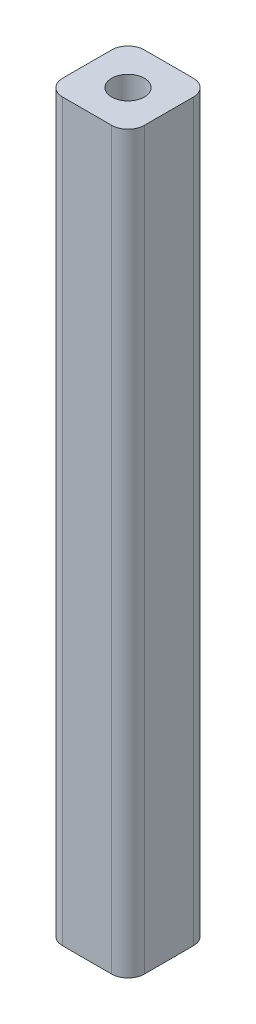
ISO-10303-21;
HEADER;
FILE_DESCRIPTION(('STEP AP214'),'2;1');
FILE_NAME('part.step','',(''),(''),'','','');
FILE_SCHEMA(('AUTOMOTIVE_DESIGN { 1 0 10303 214 1 1 1 1 }'));
ENDSEC;
DATA;
#1=APPLICATION_CONTEXT('core data for automotive mechanical design processes');
#2=APPLICATION_PROTOCOL_DEFINITION('international standard','automotive_design',2000,#1);
#3=PRODUCT_CONTEXT('',#1,'mechanical');
#4=PRODUCT('Part','Part','',(#3));
#5=PRODUCT_RELATED_PRODUCT_CATEGORY('part','',(#4));
#6=PRODUCT_DEFINITION_FORMATION('','',#4);
#7=PRODUCT_DEFINITION_CONTEXT('part definition',#1,'design');
#8=PRODUCT_DEFINITION('design','',#6,#7);
#9=PRODUCT_DEFINITION_SHAPE('','',#8);
#10=(LENGTH_UNIT() NAMED_UNIT(*) SI_UNIT(.MILLI.,.METRE.));
#11=(NAMED_UNIT(*) PLANE_ANGLE_UNIT() SI_UNIT($,.RADIAN.));
#12=(NAMED_UNIT(*) SI_UNIT($,.STERADIAN.) SOLID_ANGLE_UNIT());
#13=UNCERTAINTY_MEASURE_WITH_UNIT(LENGTH_MEASURE(1.E-05),#10,'distance_accuracy_value','');
#14=(GEOMETRIC_REPRESENTATION_CONTEXT(3) GLOBAL_UNCERTAINTY_ASSIGNED_CONTEXT((#13)) GLOBAL_UNIT_ASSIGNED_CONTEXT((#10,
#11,#12)) REPRESENTATION_CONTEXT('',''));
#15=CARTESIAN_POINT('',(0.,0.,0.));
#16=DIRECTION('',(0.,0.,1.));
#17=DIRECTION('',(1.,0.,0.));
#18=AXIS2_PLACEMENT_3D('',#15,#16,#17);
#19=CARTESIAN_POINT('',(-5.,90.,5.));
#20=DIRECTION('',(1.,0.,0.));
#21=DIRECTION('',(0.,0.,-1.));
#22=AXIS2_PLACEMENT_3D('',#19,#20,#21);
#23=PLANE('',#22);
#24=DIRECTION('',(0.,0.,1.));
#25=VECTOR('',#24,1.);
#26=CARTESIAN_POINT('',(-5.,0.,5.));
#27=LINE('',#26,#25);
#28=CARTESIAN_POINT('',(-5.,0.,-3.));
#29=VERTEX_POINT('',#28);
#30=CARTESIAN_POINT('',(-5.,0.,3.));
#31=VERTEX_POINT('',#30);
#32=EDGE_CURVE('E127',#29,#31,#27,.T.);
#33=ORIENTED_EDGE('',*,*,#32,.T.);
#34=DIRECTION('',(0.,-1.,0.));
#35=VECTOR('',#34,1.);
#36=CARTESIAN_POINT('',(-5.,90.,3.));
#37=LINE('',#36,#35);
#38=CARTESIAN_POINT('',(-5.,90.,3.));
#39=VERTEX_POINT('',#38);
#40=EDGE_CURVE('E105',#31,#39,#37,.F.);
#41=ORIENTED_EDGE('',*,*,#40,.T.);
#42=DIRECTION('',(0.,0.,1.));
#43=VECTOR('',#42,1.);
#44=CARTESIAN_POINT('',(-5.,90.,5.));
#45=LINE('',#44,#43);
#46=CARTESIAN_POINT('',(-5.,90.,-3.));
#47=VERTEX_POINT('',#46);
#48=EDGE_CURVE('E137',#47,#39,#45,.T.);
#49=ORIENTED_EDGE('',*,*,#48,.F.);
#50=DIRECTION('',(0.,-1.,0.));
#51=VECTOR('',#50,1.);
#52=CARTESIAN_POINT('',(-5.,90.,-3.));
#53=LINE('',#52,#51);
#54=EDGE_CURVE('E110',#47,#29,#53,.T.);
#55=ORIENTED_EDGE('',*,*,#54,.T.);
#56=EDGE_LOOP('',(#33,#41,#49,#55));
#57=FACE_BOUND('',#56,.T.);
#58=ADVANCED_FACE('F34',(#57),#23,.F.);
#59=CARTESIAN_POINT('',(5.,90.,5.));
#60=DIRECTION('',(0.,0.,-1.));
#61=DIRECTION('',(-1.,0.,0.));
#62=AXIS2_PLACEMENT_3D('',#59,#60,#61);
#63=PLANE('',#62);
#64=DIRECTION('',(1.,0.,0.));
#65=VECTOR('',#64,1.);
#66=CARTESIAN_POINT('',(5.,90.,5.));
#67=LINE('',#66,#65);
#68=CARTESIAN_POINT('',(-3.,90.,5.));
#69=VERTEX_POINT('',#68);
#70=CARTESIAN_POINT('',(3.,90.,5.));
#71=VERTEX_POINT('',#70);
#72=EDGE_CURVE('E120',#69,#71,#67,.T.);
#73=ORIENTED_EDGE('',*,*,#72,.F.);
#74=DIRECTION('',(0.,-1.,0.));
#75=VECTOR('',#74,1.);
#76=CARTESIAN_POINT('',(-3.,90.,5.));
#77=LINE('',#76,#75);
#78=CARTESIAN_POINT('',(-3.,0.,5.));
#79=VERTEX_POINT('',#78);
#80=EDGE_CURVE('E104',#69,#79,#77,.T.);
#81=ORIENTED_EDGE('',*,*,#80,.T.);
#82=DIRECTION('',(1.,0.,0.));
#83=VECTOR('',#82,1.);
#84=CARTESIAN_POINT('',(5.,0.,5.));
#85=LINE('',#84,#83);
#86=CARTESIAN_POINT('',(3.,0.,5.));
#87=VERTEX_POINT('',#86);
#88=EDGE_CURVE('E117',#79,#87,#85,.T.);
#89=ORIENTED_EDGE('',*,*,#88,.T.);
#90=DIRECTION('',(0.,-1.,0.));
#91=VECTOR('',#90,1.);
#92=CARTESIAN_POINT('',(3.,90.,5.));
#93=LINE('',#92,#91);
#94=EDGE_CURVE('E122',#87,#71,#93,.F.);
#95=ORIENTED_EDGE('',*,*,#94,.T.);
#96=EDGE_LOOP('',(#73,#81,#89,#95));
#97=FACE_BOUND('',#96,.T.);
#98=ADVANCED_FACE('F116',(#97),#63,.F.);
#99=CARTESIAN_POINT('',(5.,90.,5.));
#100=DIRECTION('',(-1.,0.,0.));
#101=DIRECTION('',(0.,0.,1.));
#102=AXIS2_PLACEMENT_3D('',#99,#100,#101);
#103=PLANE('',#102);
#104=DIRECTION('',(0.,0.,-1.));
#105=VECTOR('',#104,1.);
#106=CARTESIAN_POINT('',(5.,90.,5.));
#107=LINE('',#106,#105);
#108=CARTESIAN_POINT('',(5.,90.,3.));
#109=VERTEX_POINT('',#108);
#110=CARTESIAN_POINT('',(5.,90.,-3.));
#111=VERTEX_POINT('',#110);
#112=EDGE_CURVE('E163',#109,#111,#107,.T.);
#113=ORIENTED_EDGE('',*,*,#112,.F.);
#114=DIRECTION('',(0.,-1.,0.));
#115=VECTOR('',#114,1.);
#116=CARTESIAN_POINT('',(5.,90.,3.));
#117=LINE('',#116,#115);
#118=CARTESIAN_POINT('',(5.,0.,3.));
#119=VERTEX_POINT('',#118);
#120=EDGE_CURVE('E156',#109,#119,#117,.T.);
#121=ORIENTED_EDGE('',*,*,#120,.T.);
#122=DIRECTION('',(0.,0.,-1.));
#123=VECTOR('',#122,1.);
#124=CARTESIAN_POINT('',(5.,0.,5.));
#125=LINE('',#124,#123);
#126=CARTESIAN_POINT('',(5.,0.,-3.));
#127=VERTEX_POINT('',#126);
#128=EDGE_CURVE('E126',#119,#127,#125,.T.);
#129=ORIENTED_EDGE('',*,*,#128,.T.);
#130=DIRECTION('',(0.,-1.,0.));
#131=VECTOR('',#130,1.);
#132=CARTESIAN_POINT('',(5.,90.,-3.));
#133=LINE('',#132,#131);
#134=EDGE_CURVE('E154',#127,#111,#133,.F.);
#135=ORIENTED_EDGE('',*,*,#134,.T.);
#136=EDGE_LOOP('',(#113,#121,#129,#135));
#137=FACE_BOUND('',#136,.T.);
#138=ADVANCED_FACE('F161',(#137),#103,.F.);
#139=CARTESIAN_POINT('',(5.,90.,-5.));
#140=DIRECTION('',(0.,0.,1.));
#141=DIRECTION('',(1.,0.,0.));
#142=AXIS2_PLACEMENT_3D('',#139,#140,#141);
#143=PLANE('',#142);
#144=DIRECTION('',(-1.,0.,0.));
#145=VECTOR('',#144,1.);
#146=CARTESIAN_POINT('',(5.,90.,-5.));
#147=LINE('',#146,#145);
#148=CARTESIAN_POINT('',(3.,90.,-5.));
#149=VERTEX_POINT('',#148);
#150=CARTESIAN_POINT('',(-3.,90.,-5.));
#151=VERTEX_POINT('',#150);
#152=EDGE_CURVE('E138',#149,#151,#147,.T.);
#153=ORIENTED_EDGE('',*,*,#152,.F.);
#154=DIRECTION('',(0.,-1.,0.));
#155=VECTOR('',#154,1.);
#156=CARTESIAN_POINT('',(3.,90.,-5.));
#157=LINE('',#156,#155);
#158=CARTESIAN_POINT('',(3.,0.,-5.));
#159=VERTEX_POINT('',#158);
#160=EDGE_CURVE('E11',#149,#159,#157,.T.);
#161=ORIENTED_EDGE('',*,*,#160,.T.);
#162=DIRECTION('',(-1.,0.,0.));
#163=VECTOR('',#162,1.);
#164=CARTESIAN_POINT('',(5.,0.,-5.));
#165=LINE('',#164,#163);
#166=CARTESIAN_POINT('',(-3.,0.,-5.));
#167=VERTEX_POINT('',#166);
#168=EDGE_CURVE('E130',#159,#167,#165,.T.);
#169=ORIENTED_EDGE('',*,*,#168,.T.);
#170=DIRECTION('',(0.,-1.,0.));
#171=VECTOR('',#170,1.);
#172=CARTESIAN_POINT('',(-3.,90.,-5.));
#173=LINE('',#172,#171);
#174=EDGE_CURVE('E42',#167,#151,#173,.F.);
#175=ORIENTED_EDGE('',*,*,#174,.T.);
#176=EDGE_LOOP('',(#153,#161,#169,#175));
#177=FACE_BOUND('',#176,.T.);
#178=ADVANCED_FACE('F170',(#177),#143,.F.);
#179=CARTESIAN_POINT('',(0.,90.,0.));
#180=DIRECTION('',(0.,1.,0.));
#181=DIRECTION('',(0.,0.,1.));
#182=AXIS2_PLACEMENT_3D('',#179,#180,#181);
#183=PLANE('',#182);
#184=CARTESIAN_POINT('',(0.,90.,0.));
#185=DIRECTION('',(0.,1.,0.));
#186=DIRECTION('',(0.,0.,1.));
#187=AXIS2_PLACEMENT_3D('',#184,#185,#186);
#188=CIRCLE('',#187,2.);
#189=CARTESIAN_POINT('',(0.,90.,2.));
#190=VERTEX_POINT('',#189);
#191=EDGE_CURVE('E177',#190,#190,#188,.T.);
#192=ORIENTED_EDGE('',*,*,#191,.F.);
#193=EDGE_LOOP('',(#192));
#194=FACE_BOUND('',#193,.T.);
#195=ORIENTED_EDGE('',*,*,#48,.T.);
#196=CARTESIAN_POINT('',(-3.,90.,3.));
#197=DIRECTION('',(0.,1.,0.));
#198=DIRECTION('',(0.,0.,1.));
#199=AXIS2_PLACEMENT_3D('',#196,#197,#198);
#200=CIRCLE('',#199,2.);
#201=EDGE_CURVE('E152',#39,#69,#200,.T.);
#202=ORIENTED_EDGE('',*,*,#201,.T.);
#203=ORIENTED_EDGE('',*,*,#72,.T.);
#204=CARTESIAN_POINT('',(3.,90.,3.));
#205=DIRECTION('',(0.,1.,0.));
#206=DIRECTION('',(0.,0.,1.));
#207=AXIS2_PLACEMENT_3D('',#204,#205,#206);
#208=CIRCLE('',#207,2.);
#209=EDGE_CURVE('E150',#71,#109,#208,.T.);
#210=ORIENTED_EDGE('',*,*,#209,.T.);
#211=ORIENTED_EDGE('',*,*,#112,.T.);
#212=CARTESIAN_POINT('',(3.,90.,-3.));
#213=DIRECTION('',(0.,1.,0.));
#214=DIRECTION('',(0.,0.,1.));
#215=AXIS2_PLACEMENT_3D('',#212,#213,#214);
#216=CIRCLE('',#215,2.);
#217=EDGE_CURVE('E55',#111,#149,#216,.T.);
#218=ORIENTED_EDGE('',*,*,#217,.T.);
#219=ORIENTED_EDGE('',*,*,#152,.T.);
#220=CARTESIAN_POINT('',(-3.,90.,-3.));
#221=DIRECTION('',(0.,1.,0.));
#222=DIRECTION('',(0.,0.,1.));
#223=AXIS2_PLACEMENT_3D('',#220,#221,#222);
#224=CIRCLE('',#223,2.);
#225=EDGE_CURVE('E147',#151,#47,#224,.T.);
#226=ORIENTED_EDGE('',*,*,#225,.T.);
#227=EDGE_LOOP('',(#195,#202,#203,#210,#211,#218,#219,#226));
#228=FACE_BOUND('',#227,.T.);
#229=ADVANCED_FACE('F200',(#194,#228),#183,.T.);
#230=CARTESIAN_POINT('',(0.,0.,0.));
#231=DIRECTION('',(0.,1.,0.));
#232=DIRECTION('',(0.,0.,1.));
#233=AXIS2_PLACEMENT_3D('',#230,#231,#232);
#234=PLANE('',#233);
#235=CARTESIAN_POINT('',(0.,0.,0.));
#236=DIRECTION('',(0.,-1.,0.));
#237=DIRECTION('',(0.,0.,-1.));
#238=AXIS2_PLACEMENT_3D('',#235,#236,#237);
#239=CIRCLE('',#238,2.);
#240=CARTESIAN_POINT('',(0.,0.,-2.));
#241=VERTEX_POINT('',#240);
#242=EDGE_CURVE('E183',#241,#241,#239,.T.);
#243=ORIENTED_EDGE('',*,*,#242,.F.);
#244=EDGE_LOOP('',(#243));
#245=FACE_BOUND('',#244,.T.);
#246=ORIENTED_EDGE('',*,*,#88,.F.);
#247=CARTESIAN_POINT('',(-3.,0.,3.));
#248=DIRECTION('',(0.,1.,0.));
#249=DIRECTION('',(0.,0.,1.));
#250=AXIS2_PLACEMENT_3D('',#247,#248,#249);
#251=CIRCLE('',#250,2.);
#252=EDGE_CURVE('E100',#79,#31,#251,.F.);
#253=ORIENTED_EDGE('',*,*,#252,.T.);
#254=ORIENTED_EDGE('',*,*,#32,.F.);
#255=CARTESIAN_POINT('',(-3.,0.,-3.));
#256=DIRECTION('',(0.,1.,0.));
#257=DIRECTION('',(0.,0.,1.));
#258=AXIS2_PLACEMENT_3D('',#255,#256,#257);
#259=CIRCLE('',#258,2.);
#260=EDGE_CURVE('E121',#29,#167,#259,.F.);
#261=ORIENTED_EDGE('',*,*,#260,.T.);
#262=ORIENTED_EDGE('',*,*,#168,.F.);
#263=CARTESIAN_POINT('',(3.,0.,-3.));
#264=DIRECTION('',(0.,1.,0.));
#265=DIRECTION('',(0.,0.,1.));
#266=AXIS2_PLACEMENT_3D('',#263,#264,#265);
#267=CIRCLE('',#266,2.);
#268=EDGE_CURVE('E141',#159,#127,#267,.F.);
#269=ORIENTED_EDGE('',*,*,#268,.T.);
#270=ORIENTED_EDGE('',*,*,#128,.F.);
#271=CARTESIAN_POINT('',(3.,0.,3.));
#272=DIRECTION('',(0.,1.,0.));
#273=DIRECTION('',(0.,0.,1.));
#274=AXIS2_PLACEMENT_3D('',#271,#272,#273);
#275=CIRCLE('',#274,2.);
#276=EDGE_CURVE('E111',#119,#87,#275,.F.);
#277=ORIENTED_EDGE('',*,*,#276,.T.);
#278=EDGE_LOOP('',(#246,#253,#254,#261,#262,#269,#270,#277));
#279=FACE_BOUND('',#278,.T.);
#280=ADVANCED_FACE('F124',(#245,#279),#234,.F.);
#281=CARTESIAN_POINT('',(0.,80.,0.));
#282=DIRECTION('',(0.,1.,0.));
#283=DIRECTION('',(0.,0.,1.));
#284=AXIS2_PLACEMENT_3D('',#281,#282,#283);
#285=CYLINDRICAL_SURFACE('',#284,2.);
#286=CARTESIAN_POINT('',(0.,80.,0.));
#287=DIRECTION('',(0.,1.,0.));
#288=DIRECTION('',(0.,0.,1.));
#289=AXIS2_PLACEMENT_3D('',#286,#287,#288);
#290=CIRCLE('',#289,2.);
#291=CARTESIAN_POINT('',(0.,80.,2.));
#292=VERTEX_POINT('',#291);
#293=EDGE_CURVE('E132',#292,#292,#290,.T.);
#294=ORIENTED_EDGE('',*,*,#293,.F.);
#295=EDGE_LOOP('',(#294));
#296=FACE_BOUND('',#295,.T.);
#297=ORIENTED_EDGE('',*,*,#191,.T.);
#298=EDGE_LOOP('',(#297));
#299=FACE_BOUND('',#298,.T.);
#300=ADVANCED_FACE('F199',(#296,#299),#285,.F.);
#301=CARTESIAN_POINT('',(0.,80.,0.));
#302=DIRECTION('',(0.,1.,0.));
#303=DIRECTION('',(0.,0.,1.));
#304=AXIS2_PLACEMENT_3D('',#301,#302,#303);
#305=PLANE('',#304);
#306=ORIENTED_EDGE('',*,*,#293,.T.);
#307=EDGE_LOOP('',(#306));
#308=FACE_BOUND('',#307,.T.);
#309=ADVANCED_FACE('F194',(#308),#305,.T.);
#310=CARTESIAN_POINT('',(0.,10.,0.));
#311=DIRECTION('',(0.,-1.,0.));
#312=DIRECTION('',(0.,0.,-1.));
#313=AXIS2_PLACEMENT_3D('',#310,#311,#312);
#314=CYLINDRICAL_SURFACE('',#313,2.);
#315=CARTESIAN_POINT('',(0.,10.,0.));
#316=DIRECTION('',(0.,-1.,0.));
#317=DIRECTION('',(0.,0.,-1.));
#318=AXIS2_PLACEMENT_3D('',#315,#316,#317);
#319=CIRCLE('',#318,2.);
#320=CARTESIAN_POINT('',(0.,10.,-2.));
#321=VERTEX_POINT('',#320);
#322=EDGE_CURVE('E180',#321,#321,#319,.T.);
#323=ORIENTED_EDGE('',*,*,#322,.F.);
#324=EDGE_LOOP('',(#323));
#325=FACE_BOUND('',#324,.T.);
#326=ORIENTED_EDGE('',*,*,#242,.T.);
#327=EDGE_LOOP('',(#326));
#328=FACE_BOUND('',#327,.T.);
#329=ADVANCED_FACE('F191',(#325,#328),#314,.F.);
#330=CARTESIAN_POINT('',(0.,10.,0.));
#331=DIRECTION('',(0.,-1.,0.));
#332=DIRECTION('',(0.,0.,-1.));
#333=AXIS2_PLACEMENT_3D('',#330,#331,#332);
#334=PLANE('',#333);
#335=ORIENTED_EDGE('',*,*,#322,.T.);
#336=EDGE_LOOP('',(#335));
#337=FACE_BOUND('',#336,.T.);
#338=ADVANCED_FACE('F189',(#337),#334,.T.);
#339=CARTESIAN_POINT('',(-3.,90.,3.));
#340=DIRECTION('',(0.,-1.,0.));
#341=DIRECTION('',(0.,0.,-1.));
#342=AXIS2_PLACEMENT_3D('',#339,#340,#341);
#343=CYLINDRICAL_SURFACE('',#342,2.);
#344=ORIENTED_EDGE('',*,*,#201,.F.);
#345=ORIENTED_EDGE('',*,*,#40,.F.);
#346=ORIENTED_EDGE('',*,*,#252,.F.);
#347=ORIENTED_EDGE('',*,*,#80,.F.);
#348=EDGE_LOOP('',(#344,#345,#346,#347));
#349=FACE_BOUND('',#348,.T.);
#350=ADVANCED_FACE('F103',(#349),#343,.T.);
#351=CARTESIAN_POINT('',(3.,90.,3.));
#352=DIRECTION('',(0.,-1.,0.));
#353=DIRECTION('',(0.,0.,-1.));
#354=AXIS2_PLACEMENT_3D('',#351,#352,#353);
#355=CYLINDRICAL_SURFACE('',#354,2.);
#356=ORIENTED_EDGE('',*,*,#209,.F.);
#357=ORIENTED_EDGE('',*,*,#94,.F.);
#358=ORIENTED_EDGE('',*,*,#276,.F.);
#359=ORIENTED_EDGE('',*,*,#120,.F.);
#360=EDGE_LOOP('',(#356,#357,#358,#359));
#361=FACE_BOUND('',#360,.T.);
#362=ADVANCED_FACE('F222',(#361),#355,.T.);
#363=CARTESIAN_POINT('',(3.,90.,-3.));
#364=DIRECTION('',(0.,-1.,0.));
#365=DIRECTION('',(0.,0.,-1.));
#366=AXIS2_PLACEMENT_3D('',#363,#364,#365);
#367=CYLINDRICAL_SURFACE('',#366,2.);
#368=ORIENTED_EDGE('',*,*,#217,.F.);
#369=ORIENTED_EDGE('',*,*,#134,.F.);
#370=ORIENTED_EDGE('',*,*,#268,.F.);
#371=ORIENTED_EDGE('',*,*,#160,.F.);
#372=EDGE_LOOP('',(#368,#369,#370,#371));
#373=FACE_BOUND('',#372,.T.);
#374=ADVANCED_FACE('F169',(#373),#367,.T.);
#375=CARTESIAN_POINT('',(-3.,90.,-3.));
#376=DIRECTION('',(0.,-1.,0.));
#377=DIRECTION('',(0.,0.,-1.));
#378=AXIS2_PLACEMENT_3D('',#375,#376,#377);
#379=CYLINDRICAL_SURFACE('',#378,2.);
#380=ORIENTED_EDGE('',*,*,#225,.F.);
#381=ORIENTED_EDGE('',*,*,#174,.F.);
#382=ORIENTED_EDGE('',*,*,#260,.F.);
#383=ORIENTED_EDGE('',*,*,#54,.F.);
#384=EDGE_LOOP('',(#380,#381,#382,#383));
#385=FACE_BOUND('',#384,.T.);
#386=ADVANCED_FACE('F36',(#385),#379,.T.);
#387=CLOSED_SHELL('',(#58,#98,#138,#178,#229,#280,#300,#309,#329,#338,#350,#362,#374,#386));
#388=MANIFOLD_SOLID_BREP('B2',#387);
#389=ADVANCED_BREP_SHAPE_REPRESENTATION('',(#18,#388),#14);
#390=SHAPE_DEFINITION_REPRESENTATION(#9,#389);
ENDSEC;
END-ISO-10303-21;
